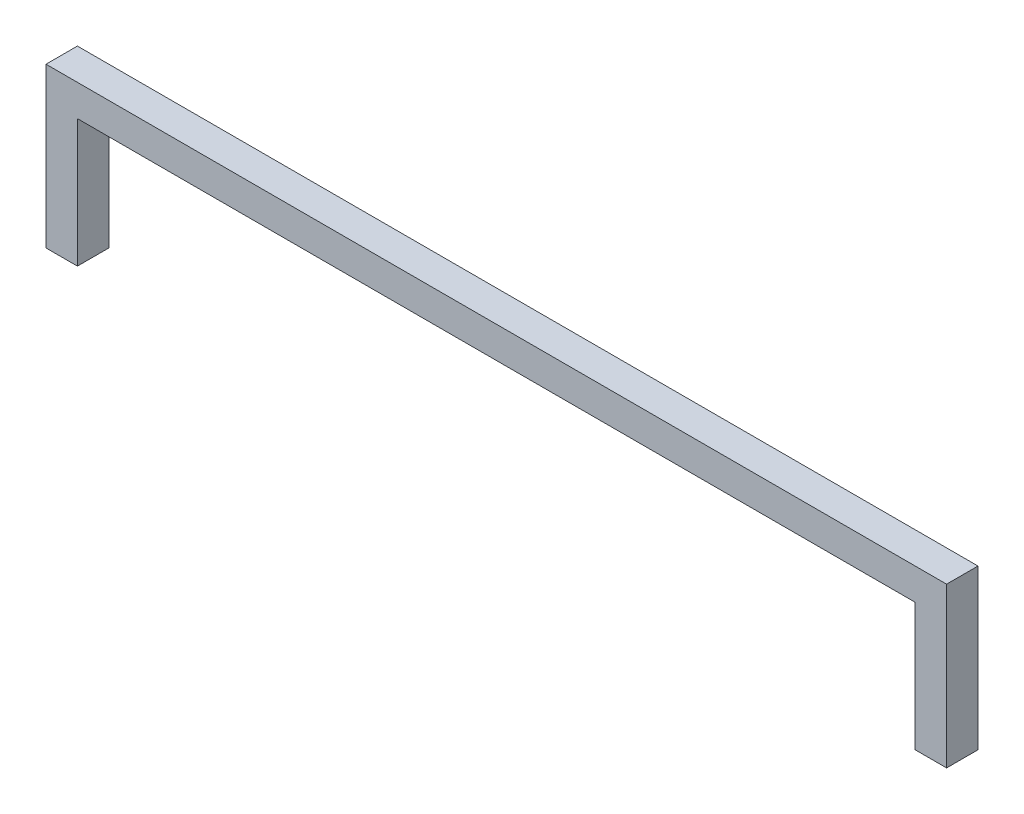
ISO-10303-21;
HEADER;
FILE_DESCRIPTION(('STEP AP214'),'2;1');
FILE_NAME('part.step','',(''),(''),'','','');
FILE_SCHEMA(('AUTOMOTIVE_DESIGN { 1 0 10303 214 1 1 1 1 }'));
ENDSEC;
DATA;
#1=APPLICATION_CONTEXT('core data for automotive mechanical design processes');
#2=APPLICATION_PROTOCOL_DEFINITION('international standard','automotive_design',2000,#1);
#3=PRODUCT_CONTEXT('',#1,'mechanical');
#4=PRODUCT('Part','Part','',(#3));
#5=PRODUCT_RELATED_PRODUCT_CATEGORY('part','',(#4));
#6=PRODUCT_DEFINITION_FORMATION('','',#4);
#7=PRODUCT_DEFINITION_CONTEXT('part definition',#1,'design');
#8=PRODUCT_DEFINITION('design','',#6,#7);
#9=PRODUCT_DEFINITION_SHAPE('','',#8);
#10=(LENGTH_UNIT() NAMED_UNIT(*) SI_UNIT(.MILLI.,.METRE.));
#11=(NAMED_UNIT(*) PLANE_ANGLE_UNIT() SI_UNIT($,.RADIAN.));
#12=(NAMED_UNIT(*) SI_UNIT($,.STERADIAN.) SOLID_ANGLE_UNIT());
#13=UNCERTAINTY_MEASURE_WITH_UNIT(LENGTH_MEASURE(1.E-05),#10,'distance_accuracy_value','');
#14=(GEOMETRIC_REPRESENTATION_CONTEXT(3) GLOBAL_UNCERTAINTY_ASSIGNED_CONTEXT((#13)) GLOBAL_UNIT_ASSIGNED_CONTEXT((#10,
#11,#12)) REPRESENTATION_CONTEXT('',''));
#15=CARTESIAN_POINT('',(0.,0.,0.));
#16=DIRECTION('',(0.,0.,1.));
#17=DIRECTION('',(1.,0.,0.));
#18=AXIS2_PLACEMENT_3D('',#15,#16,#17);
#19=CARTESIAN_POINT('',(-30.6185567010309,54.2731958762887,15.));
#20=DIRECTION('',(-1.,0.,0.));
#21=DIRECTION('',(0.,-1.,0.));
#22=AXIS2_PLACEMENT_3D('',#19,#20,#21);
#23=PLANE('',#22);
#24=DIRECTION('',(0.,1.,0.));
#25=VECTOR('',#24,1.);
#26=CARTESIAN_POINT('',(-30.6185567010309,54.2731958762887,0.));
#27=LINE('',#26,#25);
#28=CARTESIAN_POINT('',(-30.6185567010309,-6.72680412371134,0.));
#29=VERTEX_POINT('',#28);
#30=CARTESIAN_POINT('',(-30.6185567010309,54.2731958762887,0.));
#31=VERTEX_POINT('',#30);
#32=EDGE_CURVE('E130',#29,#31,#27,.T.);
#33=ORIENTED_EDGE('',*,*,#32,.T.);
#34=DIRECTION('',(0.,0.,-1.));
#35=VECTOR('',#34,1.);
#36=CARTESIAN_POINT('',(-30.6185567010309,54.2731958762887,15.));
#37=LINE('',#36,#35);
#38=CARTESIAN_POINT('',(-30.6185567010309,54.2731958762887,15.));
#39=VERTEX_POINT('',#38);
#40=EDGE_CURVE('E11',#39,#31,#37,.T.);
#41=ORIENTED_EDGE('',*,*,#40,.F.);
#42=DIRECTION('',(0.,1.,0.));
#43=VECTOR('',#42,1.);
#44=CARTESIAN_POINT('',(-30.6185567010309,54.2731958762887,15.));
#45=LINE('',#44,#43);
#46=CARTESIAN_POINT('',(-30.6185567010309,-6.72680412371134,15.));
#47=VERTEX_POINT('',#46);
#48=EDGE_CURVE('E144',#47,#39,#45,.T.);
#49=ORIENTED_EDGE('',*,*,#48,.F.);
#50=DIRECTION('',(0.,0.,-1.));
#51=VECTOR('',#50,1.);
#52=CARTESIAN_POINT('',(-30.6185567010309,-6.72680412371134,15.));
#53=LINE('',#52,#51);
#54=EDGE_CURVE('E126',#47,#29,#53,.T.);
#55=ORIENTED_EDGE('',*,*,#54,.T.);
#56=EDGE_LOOP('',(#33,#41,#49,#55));
#57=FACE_BOUND('',#56,.T.);
#58=ADVANCED_FACE('F34',(#57),#23,.F.);
#59=CARTESIAN_POINT('',(369.381443298969,54.2731958762887,15.));
#60=DIRECTION('',(0.,1.,0.));
#61=DIRECTION('',(-1.,0.,0.));
#62=AXIS2_PLACEMENT_3D('',#59,#60,#61);
#63=PLANE('',#62);
#64=DIRECTION('',(1.,0.,0.));
#65=VECTOR('',#64,1.);
#66=CARTESIAN_POINT('',(369.381443298969,54.2731958762887,0.));
#67=LINE('',#66,#65);
#68=CARTESIAN_POINT('',(369.381443298969,54.2731958762887,0.));
#69=VERTEX_POINT('',#68);
#70=EDGE_CURVE('E133',#31,#69,#67,.T.);
#71=ORIENTED_EDGE('',*,*,#70,.T.);
#72=DIRECTION('',(0.,0.,-1.));
#73=VECTOR('',#72,1.);
#74=CARTESIAN_POINT('',(369.381443298969,54.2731958762887,15.));
#75=LINE('',#74,#73);
#76=CARTESIAN_POINT('',(369.381443298969,54.2731958762887,15.));
#77=VERTEX_POINT('',#76);
#78=EDGE_CURVE('E42',#77,#69,#75,.T.);
#79=ORIENTED_EDGE('',*,*,#78,.F.);
#80=DIRECTION('',(1.,0.,0.));
#81=VECTOR('',#80,1.);
#82=CARTESIAN_POINT('',(369.381443298969,54.2731958762887,15.));
#83=LINE('',#82,#81);
#84=EDGE_CURVE('E93',#39,#77,#83,.T.);
#85=ORIENTED_EDGE('',*,*,#84,.F.);
#86=ORIENTED_EDGE('',*,*,#40,.T.);
#87=EDGE_LOOP('',(#71,#79,#85,#86));
#88=FACE_BOUND('',#87,.T.);
#89=ADVANCED_FACE('F179',(#88),#63,.F.);
#90=CARTESIAN_POINT('',(369.381443298969,-6.72680412371129,15.));
#91=DIRECTION('',(1.,0.,0.));
#92=DIRECTION('',(0.,0.,-1.));
#93=AXIS2_PLACEMENT_3D('',#90,#91,#92);
#94=PLANE('',#93);
#95=DIRECTION('',(0.,-1.,0.));
#96=VECTOR('',#95,1.);
#97=CARTESIAN_POINT('',(369.381443298969,-6.72680412371129,0.));
#98=LINE('',#97,#96);
#99=CARTESIAN_POINT('',(369.381443298969,-6.72680412371129,0.));
#100=VERTEX_POINT('',#99);
#101=EDGE_CURVE('E135',#69,#100,#98,.T.);
#102=ORIENTED_EDGE('',*,*,#101,.T.);
#103=DIRECTION('',(0.,0.,-1.));
#104=VECTOR('',#103,1.);
#105=CARTESIAN_POINT('',(369.381443298969,-6.72680412371129,15.));
#106=LINE('',#105,#104);
#107=CARTESIAN_POINT('',(369.381443298969,-6.72680412371129,15.));
#108=VERTEX_POINT('',#107);
#109=EDGE_CURVE('E151',#108,#100,#106,.T.);
#110=ORIENTED_EDGE('',*,*,#109,.F.);
#111=DIRECTION('',(0.,-1.,0.));
#112=VECTOR('',#111,1.);
#113=CARTESIAN_POINT('',(369.381443298969,-6.72680412371129,15.));
#114=LINE('',#113,#112);
#115=EDGE_CURVE('E159',#77,#108,#114,.T.);
#116=ORIENTED_EDGE('',*,*,#115,.F.);
#117=ORIENTED_EDGE('',*,*,#78,.T.);
#118=EDGE_LOOP('',(#102,#110,#116,#117));
#119=FACE_BOUND('',#118,.T.);
#120=ADVANCED_FACE('F157',(#119),#94,.F.);
#121=CARTESIAN_POINT('',(384.381443298969,-6.72680412371129,15.));
#122=DIRECTION('',(0.,1.,0.));
#123=DIRECTION('',(-1.,0.,0.));
#124=AXIS2_PLACEMENT_3D('',#121,#122,#123);
#125=PLANE('',#124);
#126=DIRECTION('',(1.,0.,0.));
#127=VECTOR('',#126,1.);
#128=CARTESIAN_POINT('',(384.381443298969,-6.72680412371129,0.));
#129=LINE('',#128,#127);
#130=CARTESIAN_POINT('',(384.381443298969,-6.72680412371129,0.));
#131=VERTEX_POINT('',#130);
#132=EDGE_CURVE('E137',#100,#131,#129,.T.);
#133=ORIENTED_EDGE('',*,*,#132,.T.);
#134=DIRECTION('',(0.,0.,-1.));
#135=VECTOR('',#134,1.);
#136=CARTESIAN_POINT('',(384.381443298969,-6.72680412371129,15.));
#137=LINE('',#136,#135);
#138=CARTESIAN_POINT('',(384.381443298969,-6.72680412371129,15.));
#139=VERTEX_POINT('',#138);
#140=EDGE_CURVE('E148',#139,#131,#137,.T.);
#141=ORIENTED_EDGE('',*,*,#140,.F.);
#142=DIRECTION('',(1.,0.,0.));
#143=VECTOR('',#142,1.);
#144=CARTESIAN_POINT('',(384.381443298969,-6.72680412371129,15.));
#145=LINE('',#144,#143);
#146=EDGE_CURVE('E171',#108,#139,#145,.T.);
#147=ORIENTED_EDGE('',*,*,#146,.F.);
#148=ORIENTED_EDGE('',*,*,#109,.T.);
#149=EDGE_LOOP('',(#133,#141,#147,#148));
#150=FACE_BOUND('',#149,.T.);
#151=ADVANCED_FACE('F167',(#150),#125,.F.);
#152=CARTESIAN_POINT('',(384.381443298969,69.2731958762887,15.));
#153=DIRECTION('',(-1.,0.,0.));
#154=DIRECTION('',(0.,0.,1.));
#155=AXIS2_PLACEMENT_3D('',#152,#153,#154);
#156=PLANE('',#155);
#157=DIRECTION('',(0.,1.,0.));
#158=VECTOR('',#157,1.);
#159=CARTESIAN_POINT('',(384.381443298969,69.2731958762887,0.));
#160=LINE('',#159,#158);
#161=CARTESIAN_POINT('',(384.381443298969,69.2731958762887,0.));
#162=VERTEX_POINT('',#161);
#163=EDGE_CURVE('E139',#131,#162,#160,.T.);
#164=ORIENTED_EDGE('',*,*,#163,.T.);
#165=DIRECTION('',(0.,0.,-1.));
#166=VECTOR('',#165,1.);
#167=CARTESIAN_POINT('',(384.381443298969,69.2731958762887,15.));
#168=LINE('',#167,#166);
#169=CARTESIAN_POINT('',(384.381443298969,69.2731958762887,15.));
#170=VERTEX_POINT('',#169);
#171=EDGE_CURVE('E121',#170,#162,#168,.T.);
#172=ORIENTED_EDGE('',*,*,#171,.F.);
#173=DIRECTION('',(0.,1.,0.));
#174=VECTOR('',#173,1.);
#175=CARTESIAN_POINT('',(384.381443298969,69.2731958762887,15.));
#176=LINE('',#175,#174);
#177=EDGE_CURVE('E112',#139,#170,#176,.T.);
#178=ORIENTED_EDGE('',*,*,#177,.F.);
#179=ORIENTED_EDGE('',*,*,#140,.T.);
#180=EDGE_LOOP('',(#164,#172,#178,#179));
#181=FACE_BOUND('',#180,.T.);
#182=ADVANCED_FACE('F170',(#181),#156,.F.);
#183=CARTESIAN_POINT('',(-45.6185567010309,69.2731958762887,15.));
#184=DIRECTION('',(0.,-1.,0.));
#185=DIRECTION('',(0.,0.,-1.));
#186=AXIS2_PLACEMENT_3D('',#183,#184,#185);
#187=PLANE('',#186);
#188=DIRECTION('',(-1.,0.,0.));
#189=VECTOR('',#188,1.);
#190=CARTESIAN_POINT('',(-45.6185567010309,69.2731958762887,0.));
#191=LINE('',#190,#189);
#192=CARTESIAN_POINT('',(-45.6185567010309,69.2731958762887,0.));
#193=VERTEX_POINT('',#192);
#194=EDGE_CURVE('E120',#162,#193,#191,.T.);
#195=ORIENTED_EDGE('',*,*,#194,.T.);
#196=DIRECTION('',(0.,0.,-1.));
#197=VECTOR('',#196,1.);
#198=CARTESIAN_POINT('',(-45.6185567010309,69.2731958762887,15.));
#199=LINE('',#198,#197);
#200=CARTESIAN_POINT('',(-45.6185567010309,69.2731958762887,15.));
#201=VERTEX_POINT('',#200);
#202=EDGE_CURVE('E117',#201,#193,#199,.T.);
#203=ORIENTED_EDGE('',*,*,#202,.F.);
#204=DIRECTION('',(-1.,0.,0.));
#205=VECTOR('',#204,1.);
#206=CARTESIAN_POINT('',(-45.6185567010309,69.2731958762887,15.));
#207=LINE('',#206,#205);
#208=EDGE_CURVE('E106',#170,#201,#207,.T.);
#209=ORIENTED_EDGE('',*,*,#208,.F.);
#210=ORIENTED_EDGE('',*,*,#171,.T.);
#211=EDGE_LOOP('',(#195,#203,#209,#210));
#212=FACE_BOUND('',#211,.T.);
#213=ADVANCED_FACE('F118',(#212),#187,.F.);
#214=CARTESIAN_POINT('',(-45.6185567010309,-6.72680412371134,15.));
#215=DIRECTION('',(1.,0.,0.));
#216=DIRECTION('',(0.,0.,-1.));
#217=AXIS2_PLACEMENT_3D('',#214,#215,#216);
#218=PLANE('',#217);
#219=DIRECTION('',(0.,-1.,0.));
#220=VECTOR('',#219,1.);
#221=CARTESIAN_POINT('',(-45.6185567010309,-6.72680412371134,0.));
#222=LINE('',#221,#220);
#223=CARTESIAN_POINT('',(-45.6185567010309,-6.72680412371134,0.));
#224=VERTEX_POINT('',#223);
#225=EDGE_CURVE('E79',#193,#224,#222,.T.);
#226=ORIENTED_EDGE('',*,*,#225,.T.);
#227=DIRECTION('',(0.,0.,-1.));
#228=VECTOR('',#227,1.);
#229=CARTESIAN_POINT('',(-45.6185567010309,-6.72680412371134,15.));
#230=LINE('',#229,#228);
#231=CARTESIAN_POINT('',(-45.6185567010309,-6.72680412371134,15.));
#232=VERTEX_POINT('',#231);
#233=EDGE_CURVE('E122',#232,#224,#230,.T.);
#234=ORIENTED_EDGE('',*,*,#233,.F.);
#235=DIRECTION('',(0.,-1.,0.));
#236=VECTOR('',#235,1.);
#237=CARTESIAN_POINT('',(-45.6185567010309,-6.72680412371134,15.));
#238=LINE('',#237,#236);
#239=EDGE_CURVE('E110',#201,#232,#238,.T.);
#240=ORIENTED_EDGE('',*,*,#239,.F.);
#241=ORIENTED_EDGE('',*,*,#202,.T.);
#242=EDGE_LOOP('',(#226,#234,#240,#241));
#243=FACE_BOUND('',#242,.T.);
#244=ADVANCED_FACE('F124',(#243),#218,.F.);
#245=CARTESIAN_POINT('',(-30.6185567010309,-6.72680412371134,15.));
#246=DIRECTION('',(0.,1.,0.));
#247=DIRECTION('',(0.,0.,1.));
#248=AXIS2_PLACEMENT_3D('',#245,#246,#247);
#249=PLANE('',#248);
#250=DIRECTION('',(1.,0.,0.));
#251=VECTOR('',#250,1.);
#252=CARTESIAN_POINT('',(-30.6185567010309,-6.72680412371134,0.));
#253=LINE('',#252,#251);
#254=EDGE_CURVE('E85',#224,#29,#253,.T.);
#255=ORIENTED_EDGE('',*,*,#254,.T.);
#256=ORIENTED_EDGE('',*,*,#54,.F.);
#257=DIRECTION('',(1.,0.,0.));
#258=VECTOR('',#257,1.);
#259=CARTESIAN_POINT('',(-30.6185567010309,-6.72680412371134,15.));
#260=LINE('',#259,#258);
#261=EDGE_CURVE('E50',#232,#47,#260,.T.);
#262=ORIENTED_EDGE('',*,*,#261,.F.);
#263=ORIENTED_EDGE('',*,*,#233,.T.);
#264=EDGE_LOOP('',(#255,#256,#262,#263));
#265=FACE_BOUND('',#264,.T.);
#266=ADVANCED_FACE('F195',(#265),#249,.F.);
#267=CARTESIAN_POINT('',(0.,0.,15.));
#268=DIRECTION('',(0.,0.,-1.));
#269=DIRECTION('',(-1.,0.,0.));
#270=AXIS2_PLACEMENT_3D('',#267,#268,#269);
#271=PLANE('',#270);
#272=ORIENTED_EDGE('',*,*,#48,.T.);
#273=ORIENTED_EDGE('',*,*,#84,.T.);
#274=ORIENTED_EDGE('',*,*,#115,.T.);
#275=ORIENTED_EDGE('',*,*,#146,.T.);
#276=ORIENTED_EDGE('',*,*,#177,.T.);
#277=ORIENTED_EDGE('',*,*,#208,.T.);
#278=ORIENTED_EDGE('',*,*,#239,.T.);
#279=ORIENTED_EDGE('',*,*,#261,.T.);
#280=EDGE_LOOP('',(#272,#273,#274,#275,#276,#277,#278,#279));
#281=FACE_BOUND('',#280,.T.);
#282=ADVANCED_FACE('F108',(#281),#271,.F.);
#283=CARTESIAN_POINT('',(0.,0.,0.));
#284=DIRECTION('',(0.,0.,-1.));
#285=DIRECTION('',(-1.,0.,0.));
#286=AXIS2_PLACEMENT_3D('',#283,#284,#285);
#287=PLANE('',#286);
#288=ORIENTED_EDGE('',*,*,#32,.F.);
#289=ORIENTED_EDGE('',*,*,#254,.F.);
#290=ORIENTED_EDGE('',*,*,#225,.F.);
#291=ORIENTED_EDGE('',*,*,#194,.F.);
#292=ORIENTED_EDGE('',*,*,#163,.F.);
#293=ORIENTED_EDGE('',*,*,#132,.F.);
#294=ORIENTED_EDGE('',*,*,#101,.F.);
#295=ORIENTED_EDGE('',*,*,#70,.F.);
#296=EDGE_LOOP('',(#288,#289,#290,#291,#292,#293,#294,#295));
#297=FACE_BOUND('',#296,.T.);
#298=ADVANCED_FACE('F163',(#297),#287,.T.);
#299=CLOSED_SHELL('',(#58,#89,#120,#151,#182,#213,#244,#266,#282,#298));
#300=MANIFOLD_SOLID_BREP('B2',#299);
#301=ADVANCED_BREP_SHAPE_REPRESENTATION('',(#18,#300),#14);
#302=SHAPE_DEFINITION_REPRESENTATION(#9,#301);
ENDSEC;
END-ISO-10303-21;
